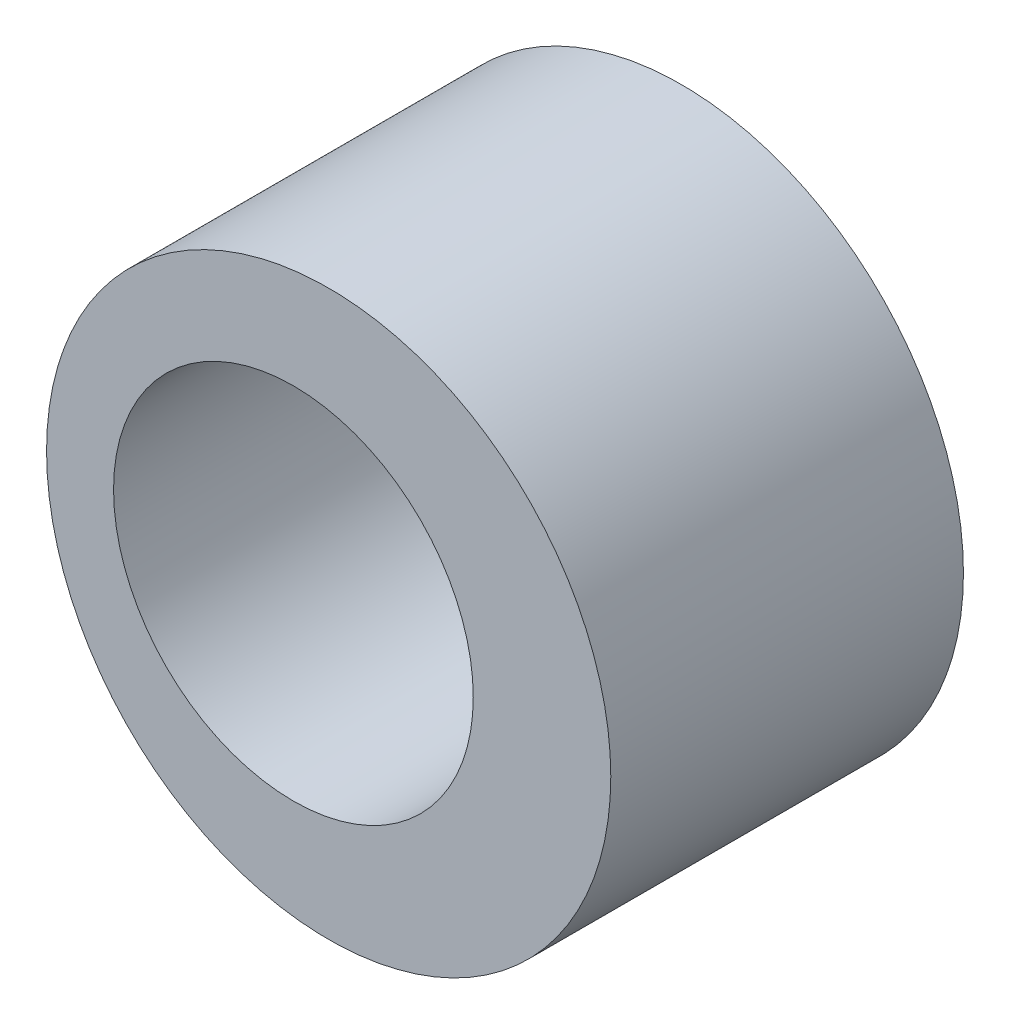
ISO-10303-21;
HEADER;
FILE_DESCRIPTION(('STEP AP214'),'2;1');
FILE_NAME('part.step','',(''),(''),'','','');
FILE_SCHEMA(('AUTOMOTIVE_DESIGN { 1 0 10303 214 1 1 1 1 }'));
ENDSEC;
DATA;
#1=APPLICATION_CONTEXT('core data for automotive mechanical design processes');
#2=APPLICATION_PROTOCOL_DEFINITION('international standard','automotive_design',2000,#1);
#3=PRODUCT_CONTEXT('',#1,'mechanical');
#4=PRODUCT('Part','Part','',(#3));
#5=PRODUCT_RELATED_PRODUCT_CATEGORY('part','',(#4));
#6=PRODUCT_DEFINITION_FORMATION('','',#4);
#7=PRODUCT_DEFINITION_CONTEXT('part definition',#1,'design');
#8=PRODUCT_DEFINITION('design','',#6,#7);
#9=PRODUCT_DEFINITION_SHAPE('','',#8);
#10=(LENGTH_UNIT() NAMED_UNIT(*) SI_UNIT(.MILLI.,.METRE.));
#11=(NAMED_UNIT(*) PLANE_ANGLE_UNIT() SI_UNIT($,.RADIAN.));
#12=(NAMED_UNIT(*) SI_UNIT($,.STERADIAN.) SOLID_ANGLE_UNIT());
#13=UNCERTAINTY_MEASURE_WITH_UNIT(LENGTH_MEASURE(1.E-05),#10,'distance_accuracy_value','');
#14=(GEOMETRIC_REPRESENTATION_CONTEXT(3) GLOBAL_UNCERTAINTY_ASSIGNED_CONTEXT((#13)) GLOBAL_UNIT_ASSIGNED_CONTEXT((#10,
#11,#12)) REPRESENTATION_CONTEXT('',''));
#15=CARTESIAN_POINT('',(0.,0.,0.));
#16=DIRECTION('',(0.,0.,1.));
#17=DIRECTION('',(1.,0.,0.));
#18=AXIS2_PLACEMENT_3D('',#15,#16,#17);
#19=CARTESIAN_POINT('',(0.,0.,5.));
#20=DIRECTION('',(0.,0.,1.));
#21=DIRECTION('',(1.,0.,0.));
#22=AXIS2_PLACEMENT_3D('',#19,#20,#21);
#23=PLANE('',#22);
#24=CARTESIAN_POINT('',(0.,0.,5.));
#25=DIRECTION('',(0.,0.,1.));
#26=DIRECTION('',(1.,0.,0.));
#27=AXIS2_PLACEMENT_3D('',#24,#25,#26);
#28=CIRCLE('',#27,4.);
#29=CARTESIAN_POINT('',(4.,0.,5.));
#30=VERTEX_POINT('',#29);
#31=EDGE_CURVE('E10',#30,#30,#28,.T.);
#32=ORIENTED_EDGE('',*,*,#31,.T.);
#33=EDGE_LOOP('',(#32));
#34=FACE_BOUND('',#33,.T.);
#35=CARTESIAN_POINT('',(-0.5,0.,5.));
#36=DIRECTION('',(0.,0.,1.));
#37=DIRECTION('',(1.,0.,0.));
#38=AXIS2_PLACEMENT_3D('',#35,#36,#37);
#39=CIRCLE('',#38,2.55);
#40=CARTESIAN_POINT('',(2.05,0.,5.));
#41=VERTEX_POINT('',#40);
#42=EDGE_CURVE('E50',#41,#41,#39,.T.);
#43=ORIENTED_EDGE('',*,*,#42,.F.);
#44=EDGE_LOOP('',(#43));
#45=FACE_BOUND('',#44,.T.);
#46=ADVANCED_FACE('F37',(#34,#45),#23,.T.);
#47=CARTESIAN_POINT('',(0.,0.,0.));
#48=DIRECTION('',(0.,0.,1.));
#49=DIRECTION('',(1.,0.,0.));
#50=AXIS2_PLACEMENT_3D('',#47,#48,#49);
#51=PLANE('',#50);
#52=CARTESIAN_POINT('',(0.,0.,0.));
#53=DIRECTION('',(0.,0.,1.));
#54=DIRECTION('',(1.,0.,0.));
#55=AXIS2_PLACEMENT_3D('',#52,#53,#54);
#56=CIRCLE('',#55,4.);
#57=CARTESIAN_POINT('',(4.,0.,0.));
#58=VERTEX_POINT('',#57);
#59=EDGE_CURVE('E41',#58,#58,#56,.T.);
#60=ORIENTED_EDGE('',*,*,#59,.F.);
#61=EDGE_LOOP('',(#60));
#62=FACE_BOUND('',#61,.T.);
#63=CARTESIAN_POINT('',(-0.5,0.,0.));
#64=DIRECTION('',(0.,0.,1.));
#65=DIRECTION('',(1.,0.,0.));
#66=AXIS2_PLACEMENT_3D('',#63,#64,#65);
#67=CIRCLE('',#66,2.55);
#68=CARTESIAN_POINT('',(2.05,0.,0.));
#69=VERTEX_POINT('',#68);
#70=EDGE_CURVE('E52',#69,#69,#67,.T.);
#71=ORIENTED_EDGE('',*,*,#70,.T.);
#72=EDGE_LOOP('',(#71));
#73=FACE_BOUND('',#72,.T.);
#74=ADVANCED_FACE('F64',(#62,#73),#51,.F.);
#75=CARTESIAN_POINT('',(0.,0.,5.));
#76=DIRECTION('',(0.,0.,-1.));
#77=DIRECTION('',(-1.,0.,0.));
#78=AXIS2_PLACEMENT_3D('',#75,#76,#77);
#79=CYLINDRICAL_SURFACE('',#78,4.);
#80=ORIENTED_EDGE('',*,*,#31,.F.);
#81=EDGE_LOOP('',(#80));
#82=FACE_BOUND('',#81,.T.);
#83=ORIENTED_EDGE('',*,*,#59,.T.);
#84=EDGE_LOOP('',(#83));
#85=FACE_BOUND('',#84,.T.);
#86=ADVANCED_FACE('F39',(#82,#85),#79,.T.);
#87=CARTESIAN_POINT('',(-0.5,0.,5.));
#88=DIRECTION('',(0.,0.,-1.));
#89=DIRECTION('',(-1.,0.,0.));
#90=AXIS2_PLACEMENT_3D('',#87,#88,#89);
#91=CYLINDRICAL_SURFACE('',#90,2.55);
#92=ORIENTED_EDGE('',*,*,#42,.T.);
#93=EDGE_LOOP('',(#92));
#94=FACE_BOUND('',#93,.T.);
#95=ORIENTED_EDGE('',*,*,#70,.F.);
#96=EDGE_LOOP('',(#95));
#97=FACE_BOUND('',#96,.T.);
#98=ADVANCED_FACE('F60',(#94,#97),#91,.F.);
#99=CLOSED_SHELL('',(#46,#74,#86,#98));
#100=MANIFOLD_SOLID_BREP('B2',#99);
#101=ADVANCED_BREP_SHAPE_REPRESENTATION('',(#18,#100),#14);
#102=SHAPE_DEFINITION_REPRESENTATION(#9,#101);
ENDSEC;
END-ISO-10303-21;
